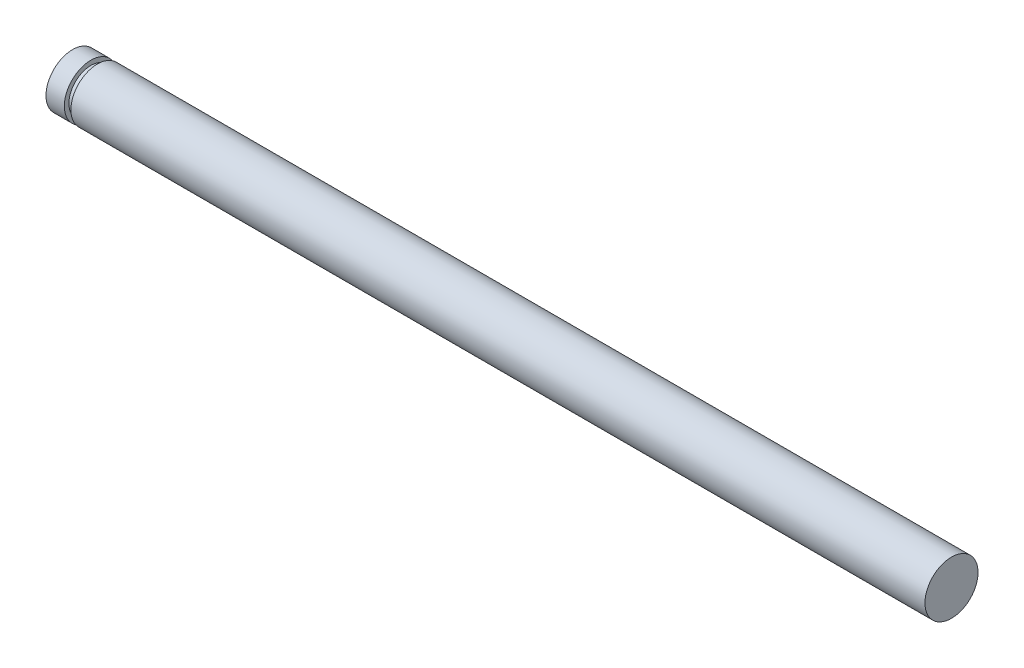
ISO-10303-21;
HEADER;
FILE_DESCRIPTION(('STEP AP214'),'2;1');
FILE_NAME('part.step','',(''),(''),'','','');
FILE_SCHEMA(('AUTOMOTIVE_DESIGN { 1 0 10303 214 1 1 1 1 }'));
ENDSEC;
DATA;
#1=APPLICATION_CONTEXT('core data for automotive mechanical design processes');
#2=APPLICATION_PROTOCOL_DEFINITION('international standard','automotive_design',2000,#1);
#3=PRODUCT_CONTEXT('',#1,'mechanical');
#4=PRODUCT('Part','Part','',(#3));
#5=PRODUCT_RELATED_PRODUCT_CATEGORY('part','',(#4));
#6=PRODUCT_DEFINITION_FORMATION('','',#4);
#7=PRODUCT_DEFINITION_CONTEXT('part definition',#1,'design');
#8=PRODUCT_DEFINITION('design','',#6,#7);
#9=PRODUCT_DEFINITION_SHAPE('','',#8);
#10=(LENGTH_UNIT() NAMED_UNIT(*) SI_UNIT(.MILLI.,.METRE.));
#11=(NAMED_UNIT(*) PLANE_ANGLE_UNIT() SI_UNIT($,.RADIAN.));
#12=(NAMED_UNIT(*) SI_UNIT($,.STERADIAN.) SOLID_ANGLE_UNIT());
#13=UNCERTAINTY_MEASURE_WITH_UNIT(LENGTH_MEASURE(1.E-05),#10,'distance_accuracy_value','');
#14=(GEOMETRIC_REPRESENTATION_CONTEXT(3) GLOBAL_UNCERTAINTY_ASSIGNED_CONTEXT((#13)) GLOBAL_UNIT_ASSIGNED_CONTEXT((#10,
#11,#12)) REPRESENTATION_CONTEXT('',''));
#15=CARTESIAN_POINT('',(0.,0.,0.));
#16=DIRECTION('',(0.,0.,1.));
#17=DIRECTION('',(1.,0.,0.));
#18=AXIS2_PLACEMENT_3D('',#15,#16,#17);
#19=CARTESIAN_POINT('',(-12.1988950276243,0.,0.));
#20=DIRECTION('',(1.,0.,0.));
#21=DIRECTION('',(0.,0.,-1.));
#22=AXIS2_PLACEMENT_3D('',#19,#20,#21);
#23=PLANE('',#22);
#24=CARTESIAN_POINT('',(-12.1988950276243,0.,0.));
#25=DIRECTION('',(-1.,0.,0.));
#26=DIRECTION('',(0.,0.,1.));
#27=AXIS2_PLACEMENT_3D('',#24,#25,#26);
#28=CIRCLE('',#27,0.725);
#29=CARTESIAN_POINT('',(-12.1988950276243,0.,0.725));
#30=VERTEX_POINT('',#29);
#31=EDGE_CURVE('E10',#30,#30,#28,.T.);
#32=ORIENTED_EDGE('',*,*,#31,.T.);
#33=EDGE_LOOP('',(#32));
#34=FACE_BOUND('',#33,.T.);
#35=ADVANCED_FACE('F35',(#34),#23,.F.);
#36=CARTESIAN_POINT('',(-12.1988950276243,0.,0.));
#37=DIRECTION('',(-1.,0.,0.));
#38=DIRECTION('',(0.,0.,1.));
#39=AXIS2_PLACEMENT_3D('',#36,#37,#38);
#40=CYLINDRICAL_SURFACE('',#39,0.725);
#41=ORIENTED_EDGE('',*,*,#31,.F.);
#42=EDGE_LOOP('',(#41));
#43=FACE_BOUND('',#42,.T.);
#44=CARTESIAN_POINT('',(-11.6988950276243,0.,0.));
#45=DIRECTION('',(-1.,0.,0.));
#46=DIRECTION('',(0.,0.,1.));
#47=AXIS2_PLACEMENT_3D('',#44,#45,#46);
#48=CIRCLE('',#47,0.725);
#49=CARTESIAN_POINT('',(-11.6988950276243,0.,0.725));
#50=VERTEX_POINT('',#49);
#51=EDGE_CURVE('E41',#50,#50,#48,.T.);
#52=ORIENTED_EDGE('',*,*,#51,.T.);
#53=EDGE_LOOP('',(#52));
#54=FACE_BOUND('',#53,.T.);
#55=ADVANCED_FACE('F73',(#43,#54),#40,.T.);
#56=CARTESIAN_POINT('',(-11.6988950276243,0.725,0.));
#57=DIRECTION('',(-1.,0.,0.));
#58=DIRECTION('',(0.,0.,1.));
#59=AXIS2_PLACEMENT_3D('',#56,#57,#58);
#60=PLANE('',#59);
#61=ORIENTED_EDGE('',*,*,#51,.F.);
#62=EDGE_LOOP('',(#61));
#63=FACE_BOUND('',#62,.T.);
#64=CARTESIAN_POINT('',(-11.6988950276243,0.,0.));
#65=DIRECTION('',(-1.,0.,0.));
#66=DIRECTION('',(0.,0.,1.));
#67=AXIS2_PLACEMENT_3D('',#64,#65,#66);
#68=CIRCLE('',#67,0.6);
#69=CARTESIAN_POINT('',(-11.6988950276243,0.,0.6));
#70=VERTEX_POINT('',#69);
#71=EDGE_CURVE('E45',#70,#70,#68,.T.);
#72=ORIENTED_EDGE('',*,*,#71,.T.);
#73=EDGE_LOOP('',(#72));
#74=FACE_BOUND('',#73,.T.);
#75=ADVANCED_FACE('F77',(#63,#74),#60,.F.);
#76=CARTESIAN_POINT('',(-12.1988950276243,0.,0.));
#77=DIRECTION('',(-1.,0.,0.));
#78=DIRECTION('',(0.,0.,1.));
#79=AXIS2_PLACEMENT_3D('',#76,#77,#78);
#80=CYLINDRICAL_SURFACE('',#79,0.6);
#81=ORIENTED_EDGE('',*,*,#71,.F.);
#82=EDGE_LOOP('',(#81));
#83=FACE_BOUND('',#82,.T.);
#84=CARTESIAN_POINT('',(-11.5188950276243,0.,0.));
#85=DIRECTION('',(-1.,0.,0.));
#86=DIRECTION('',(0.,0.,1.));
#87=AXIS2_PLACEMENT_3D('',#84,#85,#86);
#88=CIRCLE('',#87,0.6);
#89=CARTESIAN_POINT('',(-11.5188950276243,0.,0.6));
#90=VERTEX_POINT('',#89);
#91=EDGE_CURVE('E49',#90,#90,#88,.T.);
#92=ORIENTED_EDGE('',*,*,#91,.T.);
#93=EDGE_LOOP('',(#92));
#94=FACE_BOUND('',#93,.T.);
#95=ADVANCED_FACE('F82',(#83,#94),#80,.T.);
#96=CARTESIAN_POINT('',(-11.5188950276243,0.6,0.));
#97=DIRECTION('',(1.,0.,0.));
#98=DIRECTION('',(0.,0.,-1.));
#99=AXIS2_PLACEMENT_3D('',#96,#97,#98);
#100=PLANE('',#99);
#101=ORIENTED_EDGE('',*,*,#91,.F.);
#102=EDGE_LOOP('',(#101));
#103=FACE_BOUND('',#102,.T.);
#104=CARTESIAN_POINT('',(-11.5188950276243,0.,0.));
#105=DIRECTION('',(-1.,0.,0.));
#106=DIRECTION('',(0.,0.,1.));
#107=AXIS2_PLACEMENT_3D('',#104,#105,#106);
#108=CIRCLE('',#107,0.725);
#109=CARTESIAN_POINT('',(-11.5188950276243,0.,0.725));
#110=VERTEX_POINT('',#109);
#111=EDGE_CURVE('E54',#110,#110,#108,.T.);
#112=ORIENTED_EDGE('',*,*,#111,.T.);
#113=EDGE_LOOP('',(#112));
#114=FACE_BOUND('',#113,.T.);
#115=ADVANCED_FACE('F69',(#103,#114),#100,.F.);
#116=CARTESIAN_POINT('',(-12.1988950276243,0.,0.));
#117=DIRECTION('',(-1.,0.,0.));
#118=DIRECTION('',(0.,0.,1.));
#119=AXIS2_PLACEMENT_3D('',#116,#117,#118);
#120=CYLINDRICAL_SURFACE('',#119,0.725);
#121=ORIENTED_EDGE('',*,*,#111,.F.);
#122=EDGE_LOOP('',(#121));
#123=FACE_BOUND('',#122,.T.);
#124=CARTESIAN_POINT('',(11.8011049723757,0.,0.));
#125=DIRECTION('',(-1.,0.,0.));
#126=DIRECTION('',(0.,0.,1.));
#127=AXIS2_PLACEMENT_3D('',#124,#125,#126);
#128=CIRCLE('',#127,0.725);
#129=CARTESIAN_POINT('',(11.8011049723757,0.,0.725));
#130=VERTEX_POINT('',#129);
#131=EDGE_CURVE('E57',#130,#130,#128,.T.);
#132=ORIENTED_EDGE('',*,*,#131,.T.);
#133=EDGE_LOOP('',(#132));
#134=FACE_BOUND('',#133,.T.);
#135=ADVANCED_FACE('F61',(#123,#134),#120,.T.);
#136=CARTESIAN_POINT('',(11.8011049723757,0.725,0.));
#137=DIRECTION('',(-1.,0.,0.));
#138=DIRECTION('',(0.,0.,1.));
#139=AXIS2_PLACEMENT_3D('',#136,#137,#138);
#140=PLANE('',#139);
#141=ORIENTED_EDGE('',*,*,#131,.F.);
#142=EDGE_LOOP('',(#141));
#143=FACE_BOUND('',#142,.T.);
#144=ADVANCED_FACE('F63',(#143),#140,.F.);
#145=CLOSED_SHELL('',(#35,#55,#75,#95,#115,#135,#144));
#146=MANIFOLD_SOLID_BREP('B2',#145);
#147=ADVANCED_BREP_SHAPE_REPRESENTATION('',(#18,#146),#14);
#148=SHAPE_DEFINITION_REPRESENTATION(#9,#147);
ENDSEC;
END-ISO-10303-21;
